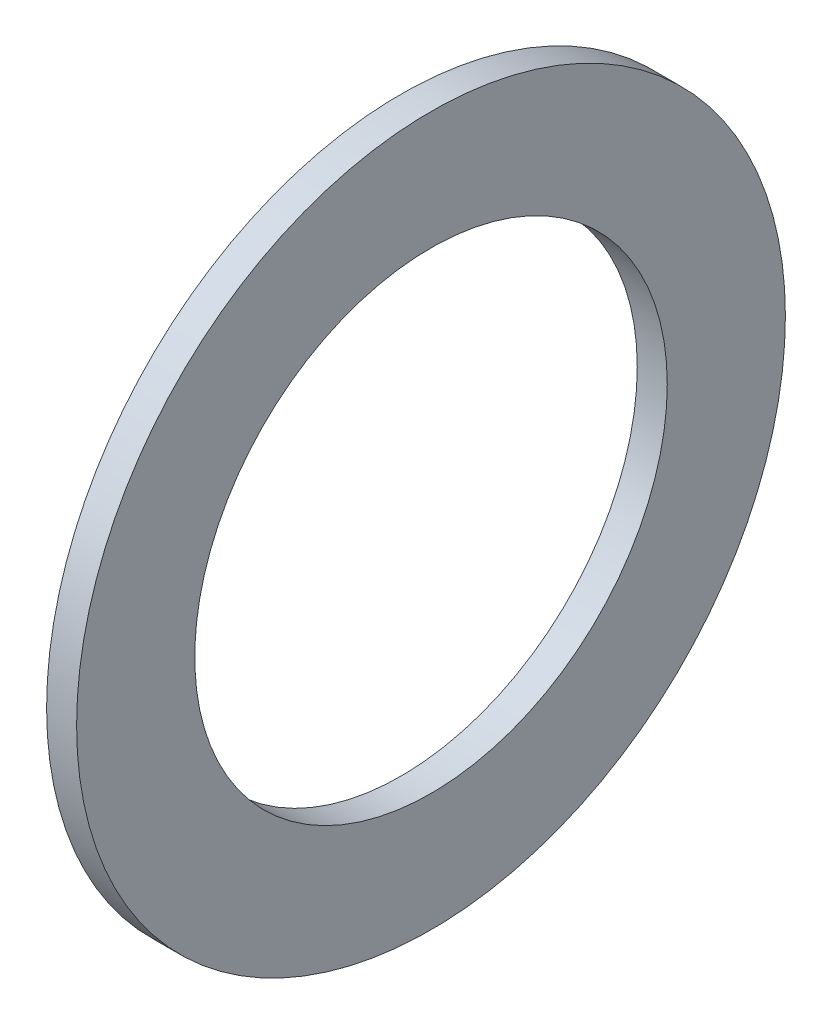
ISO-10303-21;
HEADER;
FILE_DESCRIPTION(('STEP AP214'),'2;1');
FILE_NAME('part.step','',(''),(''),'','','');
FILE_SCHEMA(('AUTOMOTIVE_DESIGN { 1 0 10303 214 1 1 1 1 }'));
ENDSEC;
DATA;
#1=APPLICATION_CONTEXT('core data for automotive mechanical design processes');
#2=APPLICATION_PROTOCOL_DEFINITION('international standard','automotive_design',2000,#1);
#3=PRODUCT_CONTEXT('',#1,'mechanical');
#4=PRODUCT('Part','Part','',(#3));
#5=PRODUCT_RELATED_PRODUCT_CATEGORY('part','',(#4));
#6=PRODUCT_DEFINITION_FORMATION('','',#4);
#7=PRODUCT_DEFINITION_CONTEXT('part definition',#1,'design');
#8=PRODUCT_DEFINITION('design','',#6,#7);
#9=PRODUCT_DEFINITION_SHAPE('','',#8);
#10=(LENGTH_UNIT() NAMED_UNIT(*) SI_UNIT(.MILLI.,.METRE.));
#11=(NAMED_UNIT(*) PLANE_ANGLE_UNIT() SI_UNIT($,.RADIAN.));
#12=(NAMED_UNIT(*) SI_UNIT($,.STERADIAN.) SOLID_ANGLE_UNIT());
#13=UNCERTAINTY_MEASURE_WITH_UNIT(LENGTH_MEASURE(1.E-05),#10,'distance_accuracy_value','');
#14=(GEOMETRIC_REPRESENTATION_CONTEXT(3) GLOBAL_UNCERTAINTY_ASSIGNED_CONTEXT((#13)) GLOBAL_UNIT_ASSIGNED_CONTEXT((#10,
#11,#12)) REPRESENTATION_CONTEXT('',''));
#15=CARTESIAN_POINT('',(0.,0.,0.));
#16=DIRECTION('',(0.,0.,1.));
#17=DIRECTION('',(1.,0.,0.));
#18=AXIS2_PLACEMENT_3D('',#15,#16,#17);
#19=CARTESIAN_POINT('',(0.508,0.,0.));
#20=DIRECTION('',(1.,0.,0.));
#21=DIRECTION('',(0.,0.,-1.));
#22=AXIS2_PLACEMENT_3D('',#19,#20,#21);
#23=PLANE('',#22);
#24=CARTESIAN_POINT('',(0.508,0.,0.));
#25=DIRECTION('',(1.,0.,0.));
#26=DIRECTION('',(0.,0.,-1.));
#27=AXIS2_PLACEMENT_3D('',#24,#25,#26);
#28=CIRCLE('',#27,6.);
#29=CARTESIAN_POINT('',(0.508,0.,-6.));
#30=VERTEX_POINT('',#29);
#31=EDGE_CURVE('E10',#30,#30,#28,.T.);
#32=ORIENTED_EDGE('',*,*,#31,.T.);
#33=EDGE_LOOP('',(#32));
#34=FACE_BOUND('',#33,.T.);
#35=CARTESIAN_POINT('',(0.508,0.,0.));
#36=DIRECTION('',(1.,0.,0.));
#37=DIRECTION('',(0.,0.,-1.));
#38=AXIS2_PLACEMENT_3D('',#35,#36,#37);
#39=CIRCLE('',#38,4.);
#40=CARTESIAN_POINT('',(0.508,0.,-4.));
#41=VERTEX_POINT('',#40);
#42=EDGE_CURVE('E44',#41,#41,#39,.T.);
#43=ORIENTED_EDGE('',*,*,#42,.F.);
#44=EDGE_LOOP('',(#43));
#45=FACE_BOUND('',#44,.T.);
#46=ADVANCED_FACE('F33',(#34,#45),#23,.T.);
#47=CARTESIAN_POINT('',(0.,0.,0.));
#48=DIRECTION('',(1.,0.,0.));
#49=DIRECTION('',(0.,0.,-1.));
#50=AXIS2_PLACEMENT_3D('',#47,#48,#49);
#51=PLANE('',#50);
#52=CARTESIAN_POINT('',(0.,0.,0.));
#53=DIRECTION('',(1.,0.,0.));
#54=DIRECTION('',(0.,0.,-1.));
#55=AXIS2_PLACEMENT_3D('',#52,#53,#54);
#56=CIRCLE('',#55,6.);
#57=CARTESIAN_POINT('',(0.,0.,-6.));
#58=VERTEX_POINT('',#57);
#59=EDGE_CURVE('E37',#58,#58,#56,.T.);
#60=ORIENTED_EDGE('',*,*,#59,.F.);
#61=EDGE_LOOP('',(#60));
#62=FACE_BOUND('',#61,.T.);
#63=CARTESIAN_POINT('',(0.,0.,0.));
#64=DIRECTION('',(1.,0.,0.));
#65=DIRECTION('',(0.,0.,-1.));
#66=AXIS2_PLACEMENT_3D('',#63,#64,#65);
#67=CIRCLE('',#66,4.);
#68=CARTESIAN_POINT('',(0.,0.,-4.));
#69=VERTEX_POINT('',#68);
#70=EDGE_CURVE('E46',#69,#69,#67,.T.);
#71=ORIENTED_EDGE('',*,*,#70,.T.);
#72=EDGE_LOOP('',(#71));
#73=FACE_BOUND('',#72,.T.);
#74=ADVANCED_FACE('F56',(#62,#73),#51,.F.);
#75=CARTESIAN_POINT('',(0.508,0.,0.));
#76=DIRECTION('',(-1.,0.,0.));
#77=DIRECTION('',(0.,0.,1.));
#78=AXIS2_PLACEMENT_3D('',#75,#76,#77);
#79=CYLINDRICAL_SURFACE('',#78,6.);
#80=ORIENTED_EDGE('',*,*,#31,.F.);
#81=EDGE_LOOP('',(#80));
#82=FACE_BOUND('',#81,.T.);
#83=ORIENTED_EDGE('',*,*,#59,.T.);
#84=EDGE_LOOP('',(#83));
#85=FACE_BOUND('',#84,.T.);
#86=ADVANCED_FACE('F35',(#82,#85),#79,.T.);
#87=CARTESIAN_POINT('',(0.508,0.,0.));
#88=DIRECTION('',(-1.,0.,0.));
#89=DIRECTION('',(0.,0.,1.));
#90=AXIS2_PLACEMENT_3D('',#87,#88,#89);
#91=CYLINDRICAL_SURFACE('',#90,4.);
#92=ORIENTED_EDGE('',*,*,#42,.T.);
#93=EDGE_LOOP('',(#92));
#94=FACE_BOUND('',#93,.T.);
#95=ORIENTED_EDGE('',*,*,#70,.F.);
#96=EDGE_LOOP('',(#95));
#97=FACE_BOUND('',#96,.T.);
#98=ADVANCED_FACE('F52',(#94,#97),#91,.F.);
#99=CLOSED_SHELL('',(#46,#74,#86,#98));
#100=MANIFOLD_SOLID_BREP('B2',#99);
#101=ADVANCED_BREP_SHAPE_REPRESENTATION('',(#18,#100),#14);
#102=SHAPE_DEFINITION_REPRESENTATION(#9,#101);
ENDSEC;
END-ISO-10303-21;
